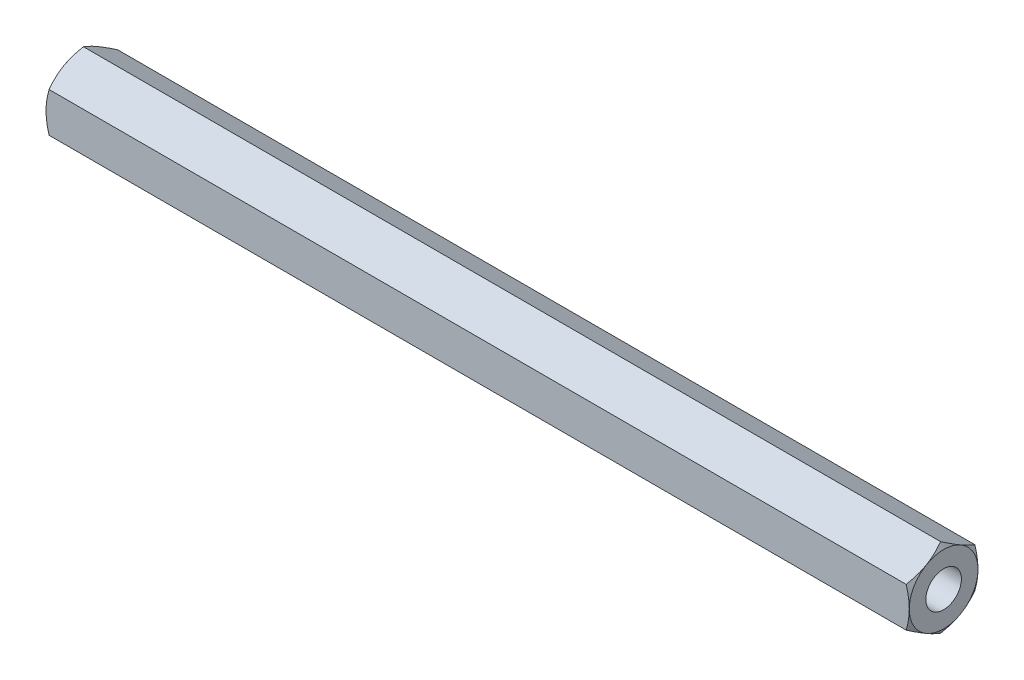
ISO-10303-21;
HEADER;
FILE_DESCRIPTION(('STEP AP214'),'2;1');
FILE_NAME('part.step','',(''),(''),'','','');
FILE_SCHEMA(('AUTOMOTIVE_DESIGN { 1 0 10303 214 1 1 1 1 }'));
ENDSEC;
DATA;
#1=APPLICATION_CONTEXT('core data for automotive mechanical design processes');
#2=APPLICATION_PROTOCOL_DEFINITION('international standard','automotive_design',2000,#1);
#3=PRODUCT_CONTEXT('',#1,'mechanical');
#4=PRODUCT('Part','Part','',(#3));
#5=PRODUCT_RELATED_PRODUCT_CATEGORY('part','',(#4));
#6=PRODUCT_DEFINITION_FORMATION('','',#4);
#7=PRODUCT_DEFINITION_CONTEXT('part definition',#1,'design');
#8=PRODUCT_DEFINITION('design','',#6,#7);
#9=PRODUCT_DEFINITION_SHAPE('','',#8);
#10=(LENGTH_UNIT() NAMED_UNIT(*) SI_UNIT(.MILLI.,.METRE.));
#11=(NAMED_UNIT(*) PLANE_ANGLE_UNIT() SI_UNIT($,.RADIAN.));
#12=(NAMED_UNIT(*) SI_UNIT($,.STERADIAN.) SOLID_ANGLE_UNIT());
#13=UNCERTAINTY_MEASURE_WITH_UNIT(LENGTH_MEASURE(1.E-05),#10,'distance_accuracy_value','');
#14=(GEOMETRIC_REPRESENTATION_CONTEXT(3) GLOBAL_UNCERTAINTY_ASSIGNED_CONTEXT((#13)) GLOBAL_UNIT_ASSIGNED_CONTEXT((#10,
#11,#12)) REPRESENTATION_CONTEXT('',''));
#15=CARTESIAN_POINT('',(0.,0.,0.));
#16=DIRECTION('',(0.,0.,1.));
#17=DIRECTION('',(1.,0.,0.));
#18=AXIS2_PLACEMENT_3D('',#15,#16,#17);
#19=CARTESIAN_POINT('',(100.5,-2.3094010767585,4.));
#20=DIRECTION('',(0.,0.866025403784439,-0.5));
#21=DIRECTION('',(0.,0.5,0.866025403784439));
#22=AXIS2_PLACEMENT_3D('',#19,#20,#21);
#23=PLANE('',#22);
#24=CARTESIAN_POINT('',(100.142667740925,-2.30928560670466,4.0002));
#25=CARTESIAN_POINT('',(100.201282126352,-2.4107717464617,3.82442084967677));
#26=CARTESIAN_POINT('',(100.254589678538,-2.51313390883499,3.64712438367362));
#27=CARTESIAN_POINT('',(100.347638329254,-2.71963072479811,3.28946140682429));
#28=CARTESIAN_POINT('',(100.38734651097,-2.82376904741904,3.10908854102985));
#29=CARTESIAN_POINT('',(100.44915778472,-3.03075510011795,2.75057818129721));
#30=CARTESIAN_POINT('',(100.471672268477,-3.13357098372492,2.57249584706486));
#31=CARTESIAN_POINT('',(100.498549376853,-3.33968651028528,2.21549328283349));
#32=CARTESIAN_POINT('',(100.502934258573,-3.44298540411434,2.0365743503559));
#33=CARTESIAN_POINT('',(100.49380992706,-3.63600352522932,1.70225715780327));
#34=CARTESIAN_POINT('',(100.482541046012,-3.72575165335065,1.54680884001293));
#35=CARTESIAN_POINT('',(100.446826009202,-3.90466320392054,1.23692494436494));
#36=CARTESIAN_POINT('',(100.422367654288,-3.99382600759478,1.08249043825587));
#37=CARTESIAN_POINT('',(100.361223935081,-4.17310641015197,0.771967672225424));
#38=CARTESIAN_POINT('',(100.324279396345,-4.26320131938131,0.615918711936899));
#39=CARTESIAN_POINT('',(100.240429927452,-4.4420474282755,0.306148164596161));
#40=CARTESIAN_POINT('',(100.193544697787,-4.53080091904966,0.152422609226221));
#41=CARTESIAN_POINT('',(100.142667740925,-4.61891762357084,-0.000199999999999044));
#42=B_SPLINE_CURVE_WITH_KNOTS('',3,(#24,#25,#26,#27,#28,#29,#30,#31,#32,#33,#34,#35,#36,#37,#38,
#39,#40,#41),.UNSPECIFIED.,.F.,.F.,(4,2,2,2,2,2,2,2,4),(0.,0.634047835695965,1.26961969224543,
1.88946157213122,2.50854226669297,3.04757825393386,3.58711366126903,4.13861653143764,
4.68903648037743),.UNSPECIFIED.);
#43=CARTESIAN_POINT('',(100.142734410092,-2.30940107675851,4.));
#44=VERTEX_POINT('',#43);
#45=CARTESIAN_POINT('',(100.5,-3.46410161513776,2.));
#46=VERTEX_POINT('',#45);
#47=EDGE_CURVE('E272',#44,#46,#42,.T.);
#48=ORIENTED_EDGE('',*,*,#47,.F.);
#49=DIRECTION('',(-1.,0.,0.));
#50=VECTOR('',#49,1.);
#51=CARTESIAN_POINT('',(100.5,-2.3094010767585,4.));
#52=LINE('',#51,#50);
#53=CARTESIAN_POINT('',(0.357265589908165,-2.30940107675851,4.));
#54=VERTEX_POINT('',#53);
#55=EDGE_CURVE('E337',#44,#54,#52,.T.);
#56=ORIENTED_EDGE('',*,*,#55,.T.);
#57=CARTESIAN_POINT('',(0.357332259074767,-4.61891762357084,-0.00019999999999909));
#58=CARTESIAN_POINT('',(0.298717873648283,-4.5174314838138,0.175579150323229));
#59=CARTESIAN_POINT('',(0.245410321462263,-4.41506932144052,0.352875616326382));
#60=CARTESIAN_POINT('',(0.152361670746403,-4.20857250547739,0.710538593175708));
#61=CARTESIAN_POINT('',(0.112653489029703,-4.10443418285647,0.890911458970153));
#62=CARTESIAN_POINT('',(0.0508422152802781,-3.89744813015756,1.24942181870279));
#63=CARTESIAN_POINT('',(0.0283277315228878,-3.79463224655059,1.42750415293514));
#64=CARTESIAN_POINT('',(0.00145062314658089,-3.58851671999023,1.78450671716651));
#65=CARTESIAN_POINT('',(-0.00293425857305764,-3.48521782616117,1.9634256496441));
#66=CARTESIAN_POINT('',(0.00619007293996928,-3.29219970504619,2.29774284219673));
#67=CARTESIAN_POINT('',(0.0174589539879931,-3.20245157692486,2.45319115998707));
#68=CARTESIAN_POINT('',(0.0531739907981922,-3.02354002635496,2.76307505563506));
#69=CARTESIAN_POINT('',(0.0776323457115324,-2.93437722268072,2.91750956174413));
#70=CARTESIAN_POINT('',(0.138776064919289,-2.75509682012354,3.22803232777458));
#71=CARTESIAN_POINT('',(0.175720603654863,-2.6650019108942,3.3840812880631));
#72=CARTESIAN_POINT('',(0.259570072548027,-2.486155802,3.69385183540384));
#73=CARTESIAN_POINT('',(0.306455302212741,-2.39740231122585,3.84757739077378));
#74=CARTESIAN_POINT('',(0.357332259074768,-2.30928560670466,4.0002));
#75=B_SPLINE_CURVE_WITH_KNOTS('',3,(#57,#58,#59,#60,#61,#62,#63,#64,#65,#66,#67,#68,#69,#70,#71,
#72,#73,#74),.UNSPECIFIED.,.F.,.F.,(4,2,2,2,2,2,2,2,4),(0.,0.634047835695966,1.26961969224544,
1.88946157213122,2.50854226669297,3.04757825393386,3.58711366126904,4.13861653143764,
4.68903648037743),.UNSPECIFIED.);
#76=CARTESIAN_POINT('',(0.,-3.46410161513776,2.));
#77=VERTEX_POINT('',#76);
#78=EDGE_CURVE('E220',#77,#54,#75,.T.);
#79=ORIENTED_EDGE('',*,*,#78,.F.);
#80=CARTESIAN_POINT('',(0.357265589908165,-4.61880215351701,0.));
#81=VERTEX_POINT('',#80);
#82=EDGE_CURVE('E335',#81,#77,#75,.T.);
#83=ORIENTED_EDGE('',*,*,#82,.F.);
#84=DIRECTION('',(-1.,0.,0.));
#85=VECTOR('',#84,1.);
#86=CARTESIAN_POINT('',(100.5,-4.61880215351701,0.));
#87=LINE('',#86,#85);
#88=CARTESIAN_POINT('',(100.142734410092,-4.61880215351701,0.));
#89=VERTEX_POINT('',#88);
#90=EDGE_CURVE('E298',#89,#81,#87,.T.);
#91=ORIENTED_EDGE('',*,*,#90,.F.);
#92=EDGE_CURVE('E267',#46,#89,#42,.T.);
#93=ORIENTED_EDGE('',*,*,#92,.F.);
#94=EDGE_LOOP('',(#48,#56,#79,#83,#91,#93));
#95=FACE_BOUND('',#94,.T.);
#96=ADVANCED_FACE('F41',(#95),#23,.F.);
#97=CARTESIAN_POINT('',(100.5,-4.61880215351701,0.));
#98=DIRECTION('',(0.,0.866025403784439,0.5));
#99=DIRECTION('',(0.,-0.5,0.866025403784439));
#100=AXIS2_PLACEMENT_3D('',#97,#98,#99);
#101=PLANE('',#100);
#102=CARTESIAN_POINT('',(100.142667740925,-4.61891762357084,0.000200000000001246));
#103=CARTESIAN_POINT('',(100.201282126352,-4.5174314838138,-0.175579150323226));
#104=CARTESIAN_POINT('',(100.254589678538,-4.41506932144052,-0.352875616326378));
#105=CARTESIAN_POINT('',(100.347638329254,-4.20857250547739,-0.710538593175705));
#106=CARTESIAN_POINT('',(100.38734651097,-4.10443418285647,-0.89091145897015));
#107=CARTESIAN_POINT('',(100.44915778472,-3.89744813015756,-1.24942181870279));
#108=CARTESIAN_POINT('',(100.471672268477,-3.79463224655059,-1.42750415293514));
#109=CARTESIAN_POINT('',(100.498549376853,-3.58851671999023,-1.78450671716651));
#110=CARTESIAN_POINT('',(100.502934258573,-3.48521782616117,-1.9634256496441));
#111=CARTESIAN_POINT('',(100.49380992706,-3.29219970504619,-2.29774284219673));
#112=CARTESIAN_POINT('',(100.482541046012,-3.20245157692486,-2.45319115998706));
#113=CARTESIAN_POINT('',(100.446826009202,-3.02354002635497,-2.76307505563505));
#114=CARTESIAN_POINT('',(100.422367654288,-2.93437722268073,-2.91750956174413));
#115=CARTESIAN_POINT('',(100.361223935081,-2.75509682012354,-3.22803232777458));
#116=CARTESIAN_POINT('',(100.324279396345,-2.6650019108942,-3.3840812880631));
#117=CARTESIAN_POINT('',(100.240429927452,-2.486155802,-3.69385183540384));
#118=CARTESIAN_POINT('',(100.193544697787,-2.39740231122585,-3.84757739077378));
#119=CARTESIAN_POINT('',(100.142667740925,-2.30928560670467,-4.0002));
#120=B_SPLINE_CURVE_WITH_KNOTS('',3,(#102,#103,#104,#105,#106,#107,#108,#109,#110,#111,#112,
#113,#114,#115,#116,#117,#118,#119),.UNSPECIFIED.,.F.,.F.,(4,2,2,2,2,2,2,2,4),(0.,
0.634047835695965,1.26961969224543,1.88946157213122,2.50854226669297,3.04757825393385,
3.58711366126903,4.13861653143764,4.68903648037743),.UNSPECIFIED.);
#121=CARTESIAN_POINT('',(100.5,-3.46410161513776,-2.));
#122=VERTEX_POINT('',#121);
#123=EDGE_CURVE('E260',#89,#122,#120,.T.);
#124=ORIENTED_EDGE('',*,*,#123,.F.);
#125=ORIENTED_EDGE('',*,*,#90,.T.);
#126=CARTESIAN_POINT('',(0.357332259074767,-2.30928560670467,-4.0002));
#127=CARTESIAN_POINT('',(0.298717873648282,-2.41077174646171,-3.82442084967677));
#128=CARTESIAN_POINT('',(0.245410321462262,-2.513133908835,-3.64712438367362));
#129=CARTESIAN_POINT('',(0.152361670746403,-2.71963072479812,-3.28946140682429));
#130=CARTESIAN_POINT('',(0.112653489029703,-2.82376904741904,-3.10908854102985));
#131=CARTESIAN_POINT('',(0.0508422152802779,-3.03075510011795,-2.75057818129721));
#132=CARTESIAN_POINT('',(0.0283277315228873,-3.13357098372492,-2.57249584706485));
#133=CARTESIAN_POINT('',(0.0014506231465802,-3.33968651028528,-2.21549328283349));
#134=CARTESIAN_POINT('',(-0.00293425857305809,-3.44298540411434,-2.0365743503559));
#135=CARTESIAN_POINT('',(0.00619007293996908,-3.63600352522932,-1.70225715780326));
#136=CARTESIAN_POINT('',(0.0174589539879929,-3.72575165335065,-1.54680884001293));
#137=CARTESIAN_POINT('',(0.0531739907981921,-3.90466320392054,-1.23692494436494));
#138=CARTESIAN_POINT('',(0.0776323457115324,-3.99382600759478,-1.08249043825587));
#139=CARTESIAN_POINT('',(0.138776064919289,-4.17310641015197,-0.771967672225419));
#140=CARTESIAN_POINT('',(0.175720603654863,-4.26320131938131,-0.615918711936895));
#141=CARTESIAN_POINT('',(0.259570072548027,-4.4420474282755,-0.306148164596159));
#142=CARTESIAN_POINT('',(0.30645530221274,-4.53080091904966,-0.15242260922622));
#143=CARTESIAN_POINT('',(0.357332259074767,-4.61891762357084,0.000200000000000922));
#144=B_SPLINE_CURVE_WITH_KNOTS('',3,(#126,#127,#128,#129,#130,#131,#132,#133,#134,#135,#136,
#137,#138,#139,#140,#141,#142,#143),.UNSPECIFIED.,.F.,.F.,(4,2,2,2,2,2,2,2,4),(0.,
0.634047835695967,1.26961969224543,1.88946157213122,2.50854226669297,3.04757825393386,
3.58711366126903,4.13861653143764,4.68903648037743),.UNSPECIFIED.);
#145=CARTESIAN_POINT('',(0.,-3.46410161513776,-2.));
#146=VERTEX_POINT('',#145);
#147=EDGE_CURVE('E232',#146,#81,#144,.T.);
#148=ORIENTED_EDGE('',*,*,#147,.F.);
#149=CARTESIAN_POINT('',(0.357265589908165,-2.30940107675851,-4.));
#150=VERTEX_POINT('',#149);
#151=EDGE_CURVE('E238',#150,#146,#144,.T.);
#152=ORIENTED_EDGE('',*,*,#151,.F.);
#153=DIRECTION('',(-1.,0.,0.));
#154=VECTOR('',#153,1.);
#155=CARTESIAN_POINT('',(100.5,-2.3094010767585,-4.));
#156=LINE('',#155,#154);
#157=CARTESIAN_POINT('',(100.142734410092,-2.30940107675851,-4.));
#158=VERTEX_POINT('',#157);
#159=EDGE_CURVE('E292',#158,#150,#156,.T.);
#160=ORIENTED_EDGE('',*,*,#159,.F.);
#161=EDGE_CURVE('E254',#122,#158,#120,.T.);
#162=ORIENTED_EDGE('',*,*,#161,.F.);
#163=EDGE_LOOP('',(#124,#125,#148,#152,#160,#162));
#164=FACE_BOUND('',#163,.T.);
#165=ADVANCED_FACE('F246',(#164),#101,.F.);
#166=CARTESIAN_POINT('',(100.5,-2.3094010767585,-4.));
#167=DIRECTION('',(0.,0.,1.));
#168=DIRECTION('',(1.,0.,0.));
#169=AXIS2_PLACEMENT_3D('',#166,#167,#168);
#170=PLANE('',#169);
#171=CARTESIAN_POINT('',(98.5858931787594,-6.12487198995893,-4.));
#172=CARTESIAN_POINT('',(98.6707637292331,-5.94924937038677,-4.));
#173=CARTESIAN_POINT('',(98.7547905961926,-5.77321152095287,-4.));
#174=CARTESIAN_POINT('',(98.9206748532029,-5.42008084777955,-4.));
#175=CARTESIAN_POINT('',(99.0025318676328,-5.24298784779928,-4.));
#176=CARTESIAN_POINT('',(99.1640255369415,-4.88656571686334,-4.));
#177=CARTESIAN_POINT('',(99.243646804937,-4.70722958889363,-4.));
#178=CARTESIAN_POINT('',(99.3994694145797,-4.34708334747264,-4.));
#179=CARTESIAN_POINT('',(99.475670934492,-4.16627331143538,-4.));
#180=CARTESIAN_POINT('',(99.6246493496057,-3.80064706744978,-4.));
#181=CARTESIAN_POINT('',(99.6973727157842,-3.6158089282277,-4.));
#182=CARTESIAN_POINT('',(99.8371237690406,-3.24395246794968,-4.));
#183=CARTESIAN_POINT('',(99.9041508224335,-3.05693390695801,-4.));
#184=CARTESIAN_POINT('',(100.030708251569,-2.68080318253771,-4.));
#185=CARTESIAN_POINT('',(100.090254565216,-2.49169643712849,-4.));
#186=CARTESIAN_POINT('',(100.199916643456,-2.11079454635851,-4.));
#187=CARTESIAN_POINT('',(100.250035390323,-1.91900027185749,-4.));
#188=CARTESIAN_POINT('',(100.338409205046,-1.532592326982,-4.));
#189=CARTESIAN_POINT('',(100.376661114043,-1.3379779203165,-4.));
#190=CARTESIAN_POINT('',(100.438725764078,-0.946402725872555,-4.));
#191=CARTESIAN_POINT('',(100.462538492348,-0.749441936019775,-4.));
#192=CARTESIAN_POINT('',(100.493618186851,-0.355451989627944,-4.));
#193=CARTESIAN_POINT('',(100.500989900761,-0.158431311094013,-4.));
#194=CARTESIAN_POINT('',(100.498795933625,0.235472085607466,-4.));
#195=CARTESIAN_POINT('',(100.489234649185,0.432354826312203,-4.));
#196=CARTESIAN_POINT('',(100.459121265386,0.768560635225516,-4.));
#197=CARTESIAN_POINT('',(100.442490703956,0.90825461838182,-4.));
#198=CARTESIAN_POINT('',(100.401786589653,1.18656349063498,-4.));
#199=CARTESIAN_POINT('',(100.377711862942,1.32517820601014,-4.));
#200=CARTESIAN_POINT('',(100.29558492905,1.73929045452971,-4.));
#201=CARTESIAN_POINT('',(100.227651113575,2.01284690528724,-4.));
#202=CARTESIAN_POINT('',(100.110483640683,2.42218253014526,-4.));
#203=CARTESIAN_POINT('',(100.068286058188,2.56009536361541,-4.));
#204=CARTESIAN_POINT('',(99.9797154197722,2.83448159101407,-4.));
#205=CARTESIAN_POINT('',(99.9333452438131,2.97095590623561,-4.));
#206=CARTESIAN_POINT('',(99.8373943008197,3.24189440516345,-4.));
#207=CARTESIAN_POINT('',(99.7878330742465,3.37636557946843,-4.));
#208=CARTESIAN_POINT('',(99.6858016462093,3.6442646115292,-4.));
#209=CARTESIAN_POINT('',(99.6333302690366,3.77769202239393,-4.));
#210=CARTESIAN_POINT('',(99.5796909934582,3.9106369898669,-4.));
#211=B_SPLINE_CURVE_WITH_KNOTS('',3,(#171,#172,#173,#174,#175,#176,#177,#178,#179,#180,#181,
#182,#183,#184,#185,#186,#187,#188,#189,#190,#191,#192,#193,#194,#195,#196,#197,#198,#199,#200,
#201,#202,#203,#204,#205,#206,#207,#208,#209,#210),.UNSPECIFIED.,.F.,.F.,(4,2,2,2,2,2,2,2,2,2,2,
2,2,2,2,2,2,2,2,4),(0.,0.585171792532272,1.17044423059927,1.7590659464599,2.34765694284827,
2.94347400997483,3.53935727210689,4.13394864697601,4.72835161391471,5.32291267067845,
5.91747425310813,6.50823685854036,7.09884609659886,7.52068140825522,7.94258327130841,
8.78701491359832,9.21965281897692,9.65199437116302,10.0819024146298,10.5119854255247),.UNSPECIFIED.);
#212=CARTESIAN_POINT('',(100.5,0.,-4.));
#213=VERTEX_POINT('',#212);
#214=EDGE_CURVE('E261',#158,#213,#211,.T.);
#215=ORIENTED_EDGE('',*,*,#214,.F.);
#216=ORIENTED_EDGE('',*,*,#159,.T.);
#217=CARTESIAN_POINT('',(1.91410682124063,-6.12487198995892,-4.));
#218=CARTESIAN_POINT('',(1.82923627076689,-5.94924937038676,-4.));
#219=CARTESIAN_POINT('',(1.74520940380739,-5.77321152095285,-4.));
#220=CARTESIAN_POINT('',(1.57932514679716,-5.42008084777954,-4.));
#221=CARTESIAN_POINT('',(1.49746813236723,-5.24298784779927,-4.));
#222=CARTESIAN_POINT('',(1.33597446305855,-4.88656571686333,-4.));
#223=CARTESIAN_POINT('',(1.25635319506303,-4.70722958889362,-4.));
#224=CARTESIAN_POINT('',(1.10053058542029,-4.34708334747263,-4.));
#225=CARTESIAN_POINT('',(1.02432906550802,-4.16627331143537,-4.));
#226=CARTESIAN_POINT('',(0.875350650394358,-3.80064706744977,-4.));
#227=CARTESIAN_POINT('',(0.802627284215842,-3.61580892822769,-4.));
#228=CARTESIAN_POINT('',(0.662876230959417,-3.24395246794968,-4.));
#229=CARTESIAN_POINT('',(0.595849177566501,-3.05693390695801,-4.));
#230=CARTESIAN_POINT('',(0.469291748430879,-2.6808031825377,-4.));
#231=CARTESIAN_POINT('',(0.409745434783834,-2.49169643712848,-4.));
#232=CARTESIAN_POINT('',(0.300083356544504,-2.11079454635851,-4.));
#233=CARTESIAN_POINT('',(0.249964609676749,-1.91900027185748,-4.));
#234=CARTESIAN_POINT('',(0.16159079495404,-1.532592326982,-4.));
#235=CARTESIAN_POINT('',(0.123338885956538,-1.33797792031649,-4.));
#236=CARTESIAN_POINT('',(0.0612742359223416,-0.946402725872551,-4.));
#237=CARTESIAN_POINT('',(0.0374615076516972,-0.749441936019771,-4.));
#238=CARTESIAN_POINT('',(0.00638181314943469,-0.355451989627941,-4.));
#239=CARTESIAN_POINT('',(-0.000989900761042853,-0.15843131109401,-4.));
#240=CARTESIAN_POINT('',(0.00120406637479438,0.23547208560747,-4.));
#241=CARTESIAN_POINT('',(0.0107653508153497,0.432354826312206,-4.));
#242=CARTESIAN_POINT('',(0.0408787346135899,0.768560635225519,-4.));
#243=CARTESIAN_POINT('',(0.0575092960439091,0.908254618381822,-4.));
#244=CARTESIAN_POINT('',(0.0982134103466913,1.18656349063498,-4.));
#245=CARTESIAN_POINT('',(0.122288137058446,1.32517820601014,-4.));
#246=CARTESIAN_POINT('',(0.204415070950231,1.7392904545297,-4.));
#247=CARTESIAN_POINT('',(0.272348886425154,2.01284690528723,-4.));
#248=CARTESIAN_POINT('',(0.389516359317205,2.42218253014525,-4.));
#249=CARTESIAN_POINT('',(0.431713941811638,2.56009536361539,-4.));
#250=CARTESIAN_POINT('',(0.520284580227764,2.83448159101405,-4.));
#251=CARTESIAN_POINT('',(0.566654756186914,2.97095590623558,-4.));
#252=CARTESIAN_POINT('',(0.662605699180289,3.24189440516342,-4.));
#253=CARTESIAN_POINT('',(0.712166925753503,3.37636557946839,-4.));
#254=CARTESIAN_POINT('',(0.814198353790705,3.64426461152915,-4.));
#255=CARTESIAN_POINT('',(0.866669730963372,3.77769202239388,-4.));
#256=CARTESIAN_POINT('',(0.920309006541796,3.91063698986685,-4.));
#257=B_SPLINE_CURVE_WITH_KNOTS('',3,(#217,#218,#219,#220,#221,#222,#223,#224,#225,#226,#227,
#228,#229,#230,#231,#232,#233,#234,#235,#236,#237,#238,#239,#240,#241,#242,#243,#244,#245,#246,
#247,#248,#249,#250,#251,#252,#253,#254,#255,#256),.UNSPECIFIED.,.F.,.F.,(4,2,2,2,2,2,2,2,2,2,2,
2,2,2,2,2,2,2,2,4),(0.,0.585171792532272,1.17044423059927,1.7590659464599,2.34765694284827,
2.94347400997483,3.53935727210689,4.133948646976,4.72835161391471,5.32291267067845,
5.91747425310812,6.50823685854036,7.09884609659886,7.52068140825521,7.94258327130839,
8.7870149135983,9.21965281897689,9.65199437116298,10.0819024146297,10.5119854255247),.UNSPECIFIED.);
#258=CARTESIAN_POINT('',(0.,0.,-4.));
#259=VERTEX_POINT('',#258);
#260=EDGE_CURVE('E239',#259,#150,#257,.F.);
#261=ORIENTED_EDGE('',*,*,#260,.F.);
#262=CARTESIAN_POINT('',(0.357265589908165,2.3094010767585,-4.));
#263=VERTEX_POINT('',#262);
#264=EDGE_CURVE('E346',#263,#259,#257,.F.);
#265=ORIENTED_EDGE('',*,*,#264,.F.);
#266=DIRECTION('',(-1.,0.,0.));
#267=VECTOR('',#266,1.);
#268=CARTESIAN_POINT('',(100.5,2.30940107675851,-4.));
#269=LINE('',#268,#267);
#270=CARTESIAN_POINT('',(100.142734410092,2.3094010767585,-4.));
#271=VERTEX_POINT('',#270);
#272=EDGE_CURVE('E299',#271,#263,#269,.T.);
#273=ORIENTED_EDGE('',*,*,#272,.F.);
#274=EDGE_CURVE('E262',#213,#271,#211,.T.);
#275=ORIENTED_EDGE('',*,*,#274,.F.);
#276=EDGE_LOOP('',(#215,#216,#261,#265,#273,#275));
#277=FACE_BOUND('',#276,.T.);
#278=ADVANCED_FACE('F249',(#277),#170,.F.);
#279=CARTESIAN_POINT('',(100.5,2.30940107675851,-4.));
#280=DIRECTION('',(0.,-0.866025403784439,0.5));
#281=DIRECTION('',(0.,-0.5,-0.866025403784439));
#282=AXIS2_PLACEMENT_3D('',#279,#280,#281);
#283=PLANE('',#282);
#284=CARTESIAN_POINT('',(100.142667740925,2.30928560670467,-4.0002));
#285=CARTESIAN_POINT('',(100.201282126352,2.41077174646171,-3.82442084967677));
#286=CARTESIAN_POINT('',(100.254589678538,2.513133908835,-3.64712438367362));
#287=CARTESIAN_POINT('',(100.347638329254,2.71963072479812,-3.28946140682429));
#288=CARTESIAN_POINT('',(100.38734651097,2.82376904741904,-3.10908854102985));
#289=CARTESIAN_POINT('',(100.44915778472,3.03075510011795,-2.75057818129721));
#290=CARTESIAN_POINT('',(100.471672268477,3.13357098372492,-2.57249584706486));
#291=CARTESIAN_POINT('',(100.498549376853,3.33968651028528,-2.21549328283349));
#292=CARTESIAN_POINT('',(100.502934258573,3.44298540411434,-2.0365743503559));
#293=CARTESIAN_POINT('',(100.49380992706,3.63600352522932,-1.70225715780327));
#294=CARTESIAN_POINT('',(100.482541046012,3.72575165335065,-1.54680884001293));
#295=CARTESIAN_POINT('',(100.446826009202,3.90466320392054,-1.23692494436495));
#296=CARTESIAN_POINT('',(100.422367654288,3.99382600759478,-1.08249043825587));
#297=CARTESIAN_POINT('',(100.361223935081,4.17310641015197,-0.771967672225423));
#298=CARTESIAN_POINT('',(100.324279396345,4.26320131938131,-0.615918711936899));
#299=CARTESIAN_POINT('',(100.240429927452,4.4420474282755,-0.306148164596162));
#300=CARTESIAN_POINT('',(100.193544697787,4.53080091904966,-0.152422609226222));
#301=CARTESIAN_POINT('',(100.142667740925,4.61891762357085,0.000199999999998931));
#302=B_SPLINE_CURVE_WITH_KNOTS('',3,(#284,#285,#286,#287,#288,#289,#290,#291,#292,#293,#294,
#295,#296,#297,#298,#299,#300,#301),.UNSPECIFIED.,.F.,.F.,(4,2,2,2,2,2,2,2,4),(0.,
0.634047835695964,1.26961969224543,1.88946157213122,2.50854226669297,3.04757825393385,
3.58711366126903,4.13861653143763,4.68903648037743),.UNSPECIFIED.);
#303=CARTESIAN_POINT('',(100.5,3.46410161513776,-2.));
#304=VERTEX_POINT('',#303);
#305=EDGE_CURVE('E360',#271,#304,#302,.T.);
#306=ORIENTED_EDGE('',*,*,#305,.F.);
#307=ORIENTED_EDGE('',*,*,#272,.T.);
#308=CARTESIAN_POINT('',(0.357332259074769,4.61891762357085,0.000199999999999029));
#309=CARTESIAN_POINT('',(0.298717873648284,4.51743148381381,-0.175579150323229));
#310=CARTESIAN_POINT('',(0.245410321462264,4.41506932144052,-0.352875616326382));
#311=CARTESIAN_POINT('',(0.152361670746404,4.2085725054774,-0.710538593175708));
#312=CARTESIAN_POINT('',(0.112653489029704,4.10443418285647,-0.890911458970153));
#313=CARTESIAN_POINT('',(0.0508422152802787,3.89744813015756,-1.24942181870279));
#314=CARTESIAN_POINT('',(0.0283277315228885,3.79463224655059,-1.42750415293514));
#315=CARTESIAN_POINT('',(0.00145062314658171,3.58851671999023,-1.78450671716651));
#316=CARTESIAN_POINT('',(-0.00293425857305672,3.48521782616117,-1.9634256496441));
#317=CARTESIAN_POINT('',(0.00619007293997046,3.29219970504619,-2.29774284219674));
#318=CARTESIAN_POINT('',(0.0174589539879944,3.20245157692486,-2.45319115998707));
#319=CARTESIAN_POINT('',(0.0531739907981932,3.02354002635497,-2.76307505563506));
#320=CARTESIAN_POINT('',(0.077632345711533,2.93437722268073,-2.91750956174413));
#321=CARTESIAN_POINT('',(0.13877606491929,2.75509682012354,-3.22803232777458));
#322=CARTESIAN_POINT('',(0.175720603654864,2.6650019108942,-3.3840812880631));
#323=CARTESIAN_POINT('',(0.259570072548028,2.48615580200001,-3.69385183540384));
#324=CARTESIAN_POINT('',(0.306455302212741,2.39740231122585,-3.84757739077378));
#325=CARTESIAN_POINT('',(0.357332259074767,2.30928560670467,-4.0002));
#326=B_SPLINE_CURVE_WITH_KNOTS('',3,(#308,#309,#310,#311,#312,#313,#314,#315,#316,#317,#318,
#319,#320,#321,#322,#323,#324,#325),.UNSPECIFIED.,.F.,.F.,(4,2,2,2,2,2,2,2,4),(0.,
0.634047835695967,1.26961969224543,1.88946157213122,2.50854226669297,3.04757825393386,
3.58711366126903,4.13861653143764,4.68903648037743),.UNSPECIFIED.);
#327=CARTESIAN_POINT('',(0.,3.46410161513776,-2.));
#328=VERTEX_POINT('',#327);
#329=EDGE_CURVE('E343',#328,#263,#326,.T.);
#330=ORIENTED_EDGE('',*,*,#329,.F.);
#331=CARTESIAN_POINT('',(0.357265589908165,4.61880215351701,0.));
#332=VERTEX_POINT('',#331);
#333=EDGE_CURVE('E226',#332,#328,#326,.T.);
#334=ORIENTED_EDGE('',*,*,#333,.F.);
#335=DIRECTION('',(-1.,0.,0.));
#336=VECTOR('',#335,1.);
#337=CARTESIAN_POINT('',(100.5,4.61880215351701,0.));
#338=LINE('',#337,#336);
#339=CARTESIAN_POINT('',(100.142734410092,4.61880215351701,0.));
#340=VERTEX_POINT('',#339);
#341=EDGE_CURVE('E303',#340,#332,#338,.T.);
#342=ORIENTED_EDGE('',*,*,#341,.F.);
#343=EDGE_CURVE('E359',#304,#340,#302,.T.);
#344=ORIENTED_EDGE('',*,*,#343,.F.);
#345=EDGE_LOOP('',(#306,#307,#330,#334,#342,#344));
#346=FACE_BOUND('',#345,.T.);
#347=ADVANCED_FACE('F358',(#346),#283,.F.);
#348=CARTESIAN_POINT('',(100.5,4.61880215351701,0.));
#349=DIRECTION('',(0.,-0.866025403784439,-0.5));
#350=DIRECTION('',(0.,0.5,-0.866025403784439));
#351=AXIS2_PLACEMENT_3D('',#348,#349,#350);
#352=PLANE('',#351);
#353=CARTESIAN_POINT('',(100.142667740925,4.61891762357085,-0.000200000000000971));
#354=CARTESIAN_POINT('',(100.201282126352,4.51743148381381,0.175579150323225));
#355=CARTESIAN_POINT('',(100.254589678538,4.41506932144052,0.352875616326377));
#356=CARTESIAN_POINT('',(100.347638329254,4.2085725054774,0.710538593175703));
#357=CARTESIAN_POINT('',(100.38734651097,4.10443418285647,0.890911458970149));
#358=CARTESIAN_POINT('',(100.44915778472,3.89744813015756,1.24942181870279));
#359=CARTESIAN_POINT('',(100.471672268477,3.79463224655059,1.42750415293514));
#360=CARTESIAN_POINT('',(100.498549376853,3.58851671999023,1.78450671716651));
#361=CARTESIAN_POINT('',(100.502934258573,3.48521782616117,1.9634256496441));
#362=CARTESIAN_POINT('',(100.49380992706,3.29219970504619,2.29774284219673));
#363=CARTESIAN_POINT('',(100.482541046012,3.20245157692486,2.45319115998707));
#364=CARTESIAN_POINT('',(100.446826009202,3.02354002635497,2.76307505563506));
#365=CARTESIAN_POINT('',(100.422367654288,2.93437722268073,2.91750956174413));
#366=CARTESIAN_POINT('',(100.361223935081,2.75509682012354,3.22803232777458));
#367=CARTESIAN_POINT('',(100.324279396345,2.6650019108942,3.3840812880631));
#368=CARTESIAN_POINT('',(100.240429927452,2.48615580200001,3.69385183540384));
#369=CARTESIAN_POINT('',(100.193544697787,2.39740231122585,3.84757739077378));
#370=CARTESIAN_POINT('',(100.142667740925,2.30928560670467,4.0002));
#371=B_SPLINE_CURVE_WITH_KNOTS('',3,(#353,#354,#355,#356,#357,#358,#359,#360,#361,#362,#363,
#364,#365,#366,#367,#368,#369,#370),.UNSPECIFIED.,.F.,.F.,(4,2,2,2,2,2,2,2,4),(0.,
0.634047835695962,1.26961969224543,1.88946157213122,2.50854226669297,3.04757825393386,
3.58711366126904,4.13861653143764,4.68903648037743),.UNSPECIFIED.);
#372=CARTESIAN_POINT('',(100.5,3.46410161513776,2.));
#373=VERTEX_POINT('',#372);
#374=EDGE_CURVE('E354',#340,#373,#371,.T.);
#375=ORIENTED_EDGE('',*,*,#374,.F.);
#376=ORIENTED_EDGE('',*,*,#341,.T.);
#377=CARTESIAN_POINT('',(0.357332259074768,2.30928560670467,4.0002));
#378=CARTESIAN_POINT('',(0.298717873648284,2.41077174646171,3.82442084967677));
#379=CARTESIAN_POINT('',(0.245410321462264,2.513133908835,3.64712438367362));
#380=CARTESIAN_POINT('',(0.152361670746404,2.71963072479812,3.28946140682429));
#381=CARTESIAN_POINT('',(0.112653489029704,2.82376904741904,3.10908854102985));
#382=CARTESIAN_POINT('',(0.0508422152802788,3.03075510011795,2.75057818129721));
#383=CARTESIAN_POINT('',(0.0283277315228887,3.13357098372492,2.57249584706486));
#384=CARTESIAN_POINT('',(0.00145062314658153,3.33968651028529,2.21549328283349));
#385=CARTESIAN_POINT('',(-0.00293425857305726,3.44298540411434,2.0365743503559));
#386=CARTESIAN_POINT('',(0.00619007293996989,3.63600352522933,1.70225715780327));
#387=CARTESIAN_POINT('',(0.0174589539879941,3.72575165335065,1.54680884001293));
#388=CARTESIAN_POINT('',(0.0531739907981935,3.90466320392055,1.23692494436494));
#389=CARTESIAN_POINT('',(0.0776323457115335,3.99382600759479,1.08249043825587));
#390=CARTESIAN_POINT('',(0.13877606491929,4.17310641015197,0.771967672225421));
#391=CARTESIAN_POINT('',(0.175720603654864,4.26320131938131,0.615918711936897));
#392=CARTESIAN_POINT('',(0.259570072548028,4.44204742827551,0.30614816459616));
#393=CARTESIAN_POINT('',(0.306455302212742,4.53080091904966,0.152422609226219));
#394=CARTESIAN_POINT('',(0.357332259074769,4.61891762357085,-0.000200000000001357));
#395=B_SPLINE_CURVE_WITH_KNOTS('',3,(#377,#378,#379,#380,#381,#382,#383,#384,#385,#386,#387,
#388,#389,#390,#391,#392,#393,#394),.UNSPECIFIED.,.F.,.F.,(4,2,2,2,2,2,2,2,4),(0.,
0.634047835695967,1.26961969224544,1.88946157213122,2.50854226669297,3.04757825393386,
3.58711366126904,4.13861653143764,4.68903648037743),.UNSPECIFIED.);
#396=CARTESIAN_POINT('',(0.,3.46410161513776,2.));
#397=VERTEX_POINT('',#396);
#398=EDGE_CURVE('E338',#397,#332,#395,.T.);
#399=ORIENTED_EDGE('',*,*,#398,.F.);
#400=CARTESIAN_POINT('',(0.357265589908165,2.30940107675851,4.));
#401=VERTEX_POINT('',#400);
#402=EDGE_CURVE('E201',#401,#397,#395,.T.);
#403=ORIENTED_EDGE('',*,*,#402,.F.);
#404=DIRECTION('',(-1.,0.,0.));
#405=VECTOR('',#404,1.);
#406=CARTESIAN_POINT('',(100.5,2.3094010767585,4.));
#407=LINE('',#406,#405);
#408=CARTESIAN_POINT('',(100.142734410092,2.30940107675851,4.));
#409=VERTEX_POINT('',#408);
#410=EDGE_CURVE('E348',#409,#401,#407,.T.);
#411=ORIENTED_EDGE('',*,*,#410,.F.);
#412=EDGE_CURVE('E166',#373,#409,#371,.T.);
#413=ORIENTED_EDGE('',*,*,#412,.F.);
#414=EDGE_LOOP('',(#375,#376,#399,#403,#411,#413));
#415=FACE_BOUND('',#414,.T.);
#416=ADVANCED_FACE('F182',(#415),#352,.F.);
#417=CARTESIAN_POINT('',(100.5,2.3094010767585,4.));
#418=DIRECTION('',(0.,0.,-1.));
#419=DIRECTION('',(-1.,0.,0.));
#420=AXIS2_PLACEMENT_3D('',#417,#418,#419);
#421=PLANE('',#420);
#422=CARTESIAN_POINT('',(98.5858931787594,-6.12487198995893,4.));
#423=CARTESIAN_POINT('',(98.6707637292331,-5.94924937038677,4.));
#424=CARTESIAN_POINT('',(98.7547905961926,-5.77321152095287,4.));
#425=CARTESIAN_POINT('',(98.9206748532029,-5.42008084777955,4.));
#426=CARTESIAN_POINT('',(99.0025318676328,-5.24298784779928,4.));
#427=CARTESIAN_POINT('',(99.1640255369415,-4.88656571686334,4.));
#428=CARTESIAN_POINT('',(99.243646804937,-4.70722958889362,4.));
#429=CARTESIAN_POINT('',(99.3994694145797,-4.34708334747263,4.));
#430=CARTESIAN_POINT('',(99.475670934492,-4.16627331143538,4.));
#431=CARTESIAN_POINT('',(99.6246493496057,-3.80064706744977,4.));
#432=CARTESIAN_POINT('',(99.6973727157842,-3.6158089282277,4.));
#433=CARTESIAN_POINT('',(99.8371237690406,-3.24395246794968,4.));
#434=CARTESIAN_POINT('',(99.9041508224335,-3.05693390695801,4.));
#435=CARTESIAN_POINT('',(100.030708251569,-2.6808031825377,4.));
#436=CARTESIAN_POINT('',(100.090254565216,-2.49169643712848,4.));
#437=CARTESIAN_POINT('',(100.199916643456,-2.11079454635851,4.));
#438=CARTESIAN_POINT('',(100.250035390323,-1.91900027185748,4.));
#439=CARTESIAN_POINT('',(100.338409205046,-1.532592326982,4.));
#440=CARTESIAN_POINT('',(100.376661114043,-1.33797792031649,4.));
#441=CARTESIAN_POINT('',(100.438725764078,-0.946402725872551,4.));
#442=CARTESIAN_POINT('',(100.462538492348,-0.749441936019771,4.));
#443=CARTESIAN_POINT('',(100.493618186851,-0.35545198962794,4.));
#444=CARTESIAN_POINT('',(100.500989900761,-0.158431311094009,4.));
#445=CARTESIAN_POINT('',(100.498795933625,0.23547208560747,4.));
#446=CARTESIAN_POINT('',(100.489234649185,0.432354826312206,4.));
#447=CARTESIAN_POINT('',(100.459121265386,0.76856063522552,4.));
#448=CARTESIAN_POINT('',(100.442490703956,0.908254618381825,4.));
#449=CARTESIAN_POINT('',(100.401786589653,1.18656349063498,4.));
#450=CARTESIAN_POINT('',(100.377711862942,1.32517820601015,4.));
#451=CARTESIAN_POINT('',(100.29558492905,1.73929045452971,4.));
#452=CARTESIAN_POINT('',(100.227651113575,2.01284690528725,4.));
#453=CARTESIAN_POINT('',(100.110483640683,2.42218253014527,4.));
#454=CARTESIAN_POINT('',(100.068286058188,2.56009536361542,4.));
#455=CARTESIAN_POINT('',(99.9797154197722,2.83448159101408,4.));
#456=CARTESIAN_POINT('',(99.9333452438131,2.97095590623562,4.));
#457=CARTESIAN_POINT('',(99.8373943008197,3.24189440516346,4.));
#458=CARTESIAN_POINT('',(99.7878330742465,3.37636557946844,4.));
#459=CARTESIAN_POINT('',(99.6858016462093,3.6442646115292,4.));
#460=CARTESIAN_POINT('',(99.6333302690366,3.77769202239394,4.));
#461=CARTESIAN_POINT('',(99.5796909934582,3.91063698986691,4.));
#462=B_SPLINE_CURVE_WITH_KNOTS('',3,(#422,#423,#424,#425,#426,#427,#428,#429,#430,#431,#432,
#433,#434,#435,#436,#437,#438,#439,#440,#441,#442,#443,#444,#445,#446,#447,#448,#449,#450,#451,
#452,#453,#454,#455,#456,#457,#458,#459,#460,#461),.UNSPECIFIED.,.F.,.F.,(4,2,2,2,2,2,2,2,2,2,2,
2,2,2,2,2,2,2,2,4),(0.,0.585171792532271,1.17044423059928,1.7590659464599,2.34765694284827,
2.94347400997484,3.53935727210689,4.13394864697601,4.72835161391471,5.32291267067845,
5.91747425310813,6.50823685854037,7.09884609659886,7.52068140825522,7.94258327130841,
8.78701491359833,9.21965281897693,9.65199437116302,10.0819024146298,10.5119854255248),.UNSPECIFIED.);
#463=CARTESIAN_POINT('',(100.5,0.,4.));
#464=VERTEX_POINT('',#463);
#465=EDGE_CURVE('E165',#409,#464,#462,.F.);
#466=ORIENTED_EDGE('',*,*,#465,.F.);
#467=ORIENTED_EDGE('',*,*,#410,.T.);
#468=CARTESIAN_POINT('',(1.91410682124064,-6.12487198995891,4.));
#469=CARTESIAN_POINT('',(1.82923627076689,-5.94924937038676,4.));
#470=CARTESIAN_POINT('',(1.74520940380739,-5.77321152095285,4.));
#471=CARTESIAN_POINT('',(1.57932514679716,-5.42008084777954,4.));
#472=CARTESIAN_POINT('',(1.49746813236723,-5.24298784779927,4.));
#473=CARTESIAN_POINT('',(1.33597446305855,-4.88656571686333,4.));
#474=CARTESIAN_POINT('',(1.25635319506303,-4.70722958889362,4.));
#475=CARTESIAN_POINT('',(1.10053058542029,-4.34708334747263,4.));
#476=CARTESIAN_POINT('',(1.02432906550802,-4.16627331143537,4.));
#477=CARTESIAN_POINT('',(0.875350650394359,-3.80064706744977,4.));
#478=CARTESIAN_POINT('',(0.802627284215842,-3.61580892822769,4.));
#479=CARTESIAN_POINT('',(0.662876230959417,-3.24395246794968,4.));
#480=CARTESIAN_POINT('',(0.595849177566501,-3.05693390695801,4.));
#481=CARTESIAN_POINT('',(0.469291748430879,-2.6808031825377,4.));
#482=CARTESIAN_POINT('',(0.409745434783835,-2.49169643712848,4.));
#483=CARTESIAN_POINT('',(0.300083356544505,-2.11079454635851,4.));
#484=CARTESIAN_POINT('',(0.24996460967675,-1.91900027185748,4.));
#485=CARTESIAN_POINT('',(0.16159079495404,-1.53259232698199,4.));
#486=CARTESIAN_POINT('',(0.123338885956539,-1.33797792031649,4.));
#487=CARTESIAN_POINT('',(0.0612742359223426,-0.946402725872548,4.));
#488=CARTESIAN_POINT('',(0.0374615076516981,-0.749441936019768,4.));
#489=CARTESIAN_POINT('',(0.0063818131494358,-0.355451989627937,4.));
#490=CARTESIAN_POINT('',(-0.000989900761041474,-0.158431311094006,4.));
#491=CARTESIAN_POINT('',(0.001204066374796,0.235472085607473,4.));
#492=CARTESIAN_POINT('',(0.0107653508153513,0.432354826312209,4.));
#493=CARTESIAN_POINT('',(0.0408787346135914,0.768560635225521,4.));
#494=CARTESIAN_POINT('',(0.0575092960439106,0.908254618381824,4.));
#495=CARTESIAN_POINT('',(0.098213410346693,1.18656349063498,4.));
#496=CARTESIAN_POINT('',(0.122288137058448,1.32517820601014,4.));
#497=CARTESIAN_POINT('',(0.204415070950233,1.7392904545297,4.));
#498=CARTESIAN_POINT('',(0.272348886425156,2.01284690528723,4.));
#499=CARTESIAN_POINT('',(0.389516359317207,2.42218253014525,4.));
#500=CARTESIAN_POINT('',(0.43171394181164,2.56009536361539,4.));
#501=CARTESIAN_POINT('',(0.520284580227766,2.83448159101405,4.));
#502=CARTESIAN_POINT('',(0.566654756186916,2.97095590623559,4.));
#503=CARTESIAN_POINT('',(0.662605699180291,3.24189440516342,4.));
#504=CARTESIAN_POINT('',(0.712166925753505,3.37636557946839,4.));
#505=CARTESIAN_POINT('',(0.814198353790707,3.64426461152915,4.));
#506=CARTESIAN_POINT('',(0.866669730963375,3.77769202239389,4.));
#507=CARTESIAN_POINT('',(0.920309006541799,3.91063698986686,4.));
#508=B_SPLINE_CURVE_WITH_KNOTS('',3,(#468,#469,#470,#471,#472,#473,#474,#475,#476,#477,#478,
#479,#480,#481,#482,#483,#484,#485,#486,#487,#488,#489,#490,#491,#492,#493,#494,#495,#496,#497,
#498,#499,#500,#501,#502,#503,#504,#505,#506,#507),.UNSPECIFIED.,.F.,.F.,(4,2,2,2,2,2,2,2,2,2,2,
2,2,2,2,2,2,2,2,4),(0.,0.58517179253227,1.17044423059927,1.7590659464599,2.34765694284827,
2.94347400997483,3.53935727210689,4.133948646976,4.72835161391471,5.32291267067845,
5.91747425310813,6.50823685854036,7.09884609659886,7.52068140825521,7.9425832713084,
8.7870149135983,9.2196528189769,9.65199437116298,10.0819024146297,10.5119854255247),.UNSPECIFIED.);
#509=CARTESIAN_POINT('',(0.,0.,4.));
#510=VERTEX_POINT('',#509);
#511=EDGE_CURVE('E190',#510,#401,#508,.T.);
#512=ORIENTED_EDGE('',*,*,#511,.F.);
#513=EDGE_CURVE('E198',#54,#510,#508,.T.);
#514=ORIENTED_EDGE('',*,*,#513,.F.);
#515=ORIENTED_EDGE('',*,*,#55,.F.);
#516=EDGE_CURVE('E157',#464,#44,#462,.F.);
#517=ORIENTED_EDGE('',*,*,#516,.F.);
#518=EDGE_LOOP('',(#466,#467,#512,#514,#515,#517));
#519=FACE_BOUND('',#518,.T.);
#520=ADVANCED_FACE('F177',(#519),#421,.F.);
#521=CARTESIAN_POINT('',(0.,0.,0.));
#522=DIRECTION('',(1.,0.,0.));
#523=DIRECTION('',(0.,0.,-1.));
#524=AXIS2_PLACEMENT_3D('',#521,#522,#523);
#525=CONICAL_SURFACE('',#524,4.,1.0471975511966);
#526=ORIENTED_EDGE('',*,*,#260,.T.);
#527=ORIENTED_EDGE('',*,*,#151,.T.);
#528=CARTESIAN_POINT('',(0.,0.,0.));
#529=DIRECTION('',(1.,0.,0.));
#530=DIRECTION('',(0.,0.,-1.));
#531=AXIS2_PLACEMENT_3D('',#528,#529,#530);
#532=CIRCLE('',#531,4.);
#533=EDGE_CURVE('E301',#146,#259,#532,.T.);
#534=ORIENTED_EDGE('',*,*,#533,.T.);
#535=EDGE_LOOP('',(#526,#527,#534));
#536=FACE_BOUND('',#535,.T.);
#537=ADVANCED_FACE('F181',(#536),#525,.T.);
#538=ORIENTED_EDGE('',*,*,#147,.T.);
#539=ORIENTED_EDGE('',*,*,#82,.T.);
#540=EDGE_CURVE('E307',#77,#146,#532,.T.);
#541=ORIENTED_EDGE('',*,*,#540,.T.);
#542=EDGE_LOOP('',(#538,#539,#541));
#543=FACE_BOUND('',#542,.T.);
#544=ADVANCED_FACE('F509',(#543),#525,.T.);
#545=ORIENTED_EDGE('',*,*,#78,.T.);
#546=ORIENTED_EDGE('',*,*,#513,.T.);
#547=EDGE_CURVE('E311',#510,#77,#532,.T.);
#548=ORIENTED_EDGE('',*,*,#547,.T.);
#549=EDGE_LOOP('',(#545,#546,#548));
#550=FACE_BOUND('',#549,.T.);
#551=ADVANCED_FACE('F325',(#550),#525,.T.);
#552=ORIENTED_EDGE('',*,*,#402,.T.);
#553=CARTESIAN_POINT('',(0.,0.,0.));
#554=DIRECTION('',(-1.,0.,0.));
#555=DIRECTION('',(0.,0.,1.));
#556=AXIS2_PLACEMENT_3D('',#553,#554,#555);
#557=CIRCLE('',#556,4.);
#558=EDGE_CURVE('E199',#510,#397,#557,.T.);
#559=ORIENTED_EDGE('',*,*,#558,.F.);
#560=ORIENTED_EDGE('',*,*,#511,.T.);
#561=EDGE_LOOP('',(#552,#559,#560));
#562=FACE_BOUND('',#561,.T.);
#563=ADVANCED_FACE('F212',(#562),#525,.T.);
#564=ORIENTED_EDGE('',*,*,#333,.T.);
#565=EDGE_CURVE('E313',#328,#397,#532,.T.);
#566=ORIENTED_EDGE('',*,*,#565,.T.);
#567=ORIENTED_EDGE('',*,*,#398,.T.);
#568=EDGE_LOOP('',(#564,#566,#567));
#569=FACE_BOUND('',#568,.T.);
#570=ADVANCED_FACE('F210',(#569),#525,.T.);
#571=ORIENTED_EDGE('',*,*,#264,.T.);
#572=EDGE_CURVE('E288',#259,#328,#532,.T.);
#573=ORIENTED_EDGE('',*,*,#572,.T.);
#574=ORIENTED_EDGE('',*,*,#329,.T.);
#575=EDGE_LOOP('',(#571,#573,#574));
#576=FACE_BOUND('',#575,.T.);
#577=ADVANCED_FACE('F207',(#576),#525,.T.);
#578=CARTESIAN_POINT('',(0.,0.,0.));
#579=DIRECTION('',(1.,0.,0.));
#580=DIRECTION('',(0.,0.,-1.));
#581=AXIS2_PLACEMENT_3D('',#578,#579,#580);
#582=PLANE('',#581);
#583=CARTESIAN_POINT('',(0.,0.,0.));
#584=DIRECTION('',(-1.,0.,0.));
#585=DIRECTION('',(0.,0.,1.));
#586=AXIS2_PLACEMENT_3D('',#583,#584,#585);
#587=CIRCLE('',#586,2.067);
#588=CARTESIAN_POINT('',(0.,0.,2.067));
#589=VERTEX_POINT('',#588);
#590=EDGE_CURVE('E145',#589,#589,#587,.T.);
#591=ORIENTED_EDGE('',*,*,#590,.F.);
#592=EDGE_LOOP('',(#591));
#593=FACE_BOUND('',#592,.T.);
#594=ORIENTED_EDGE('',*,*,#572,.F.);
#595=ORIENTED_EDGE('',*,*,#533,.F.);
#596=ORIENTED_EDGE('',*,*,#540,.F.);
#597=ORIENTED_EDGE('',*,*,#547,.F.);
#598=ORIENTED_EDGE('',*,*,#558,.T.);
#599=ORIENTED_EDGE('',*,*,#565,.F.);
#600=EDGE_LOOP('',(#594,#595,#596,#597,#598,#599));
#601=FACE_BOUND('',#600,.T.);
#602=ADVANCED_FACE('F184',(#593,#601),#582,.F.);
#603=CARTESIAN_POINT('',(100.142734410092,0.,0.));
#604=DIRECTION('',(-1.,0.,0.));
#605=DIRECTION('',(0.,0.,1.));
#606=AXIS2_PLACEMENT_3D('',#603,#604,#605);
#607=CONICAL_SURFACE('',#606,4.61880215351701,1.0471975511966);
#608=ORIENTED_EDGE('',*,*,#161,.T.);
#609=ORIENTED_EDGE('',*,*,#214,.T.);
#610=CARTESIAN_POINT('',(100.5,0.,0.));
#611=DIRECTION('',(1.,0.,0.));
#612=DIRECTION('',(0.,0.,-1.));
#613=AXIS2_PLACEMENT_3D('',#610,#611,#612);
#614=CIRCLE('',#613,4.);
#615=EDGE_CURVE('E45',#122,#213,#614,.T.);
#616=ORIENTED_EDGE('',*,*,#615,.F.);
#617=EDGE_LOOP('',(#608,#609,#616));
#618=FACE_BOUND('',#617,.T.);
#619=ADVANCED_FACE('F285',(#618),#607,.T.);
#620=ORIENTED_EDGE('',*,*,#92,.T.);
#621=ORIENTED_EDGE('',*,*,#123,.T.);
#622=EDGE_CURVE('E280',#46,#122,#614,.T.);
#623=ORIENTED_EDGE('',*,*,#622,.F.);
#624=EDGE_LOOP('',(#620,#621,#623));
#625=FACE_BOUND('',#624,.T.);
#626=ADVANCED_FACE('F278',(#625),#607,.T.);
#627=ORIENTED_EDGE('',*,*,#47,.T.);
#628=EDGE_CURVE('E289',#464,#46,#614,.T.);
#629=ORIENTED_EDGE('',*,*,#628,.F.);
#630=ORIENTED_EDGE('',*,*,#516,.T.);
#631=EDGE_LOOP('',(#627,#629,#630));
#632=FACE_BOUND('',#631,.T.);
#633=ADVANCED_FACE('F173',(#632),#607,.T.);
#634=ORIENTED_EDGE('',*,*,#412,.T.);
#635=ORIENTED_EDGE('',*,*,#465,.T.);
#636=CARTESIAN_POINT('',(100.5,0.,0.));
#637=DIRECTION('',(-1.,0.,0.));
#638=DIRECTION('',(0.,0.,1.));
#639=AXIS2_PLACEMENT_3D('',#636,#637,#638);
#640=CIRCLE('',#639,4.);
#641=EDGE_CURVE('E63',#464,#373,#640,.T.);
#642=ORIENTED_EDGE('',*,*,#641,.T.);
#643=EDGE_LOOP('',(#634,#635,#642));
#644=FACE_BOUND('',#643,.T.);
#645=ADVANCED_FACE('F476',(#644),#607,.T.);
#646=ORIENTED_EDGE('',*,*,#343,.T.);
#647=ORIENTED_EDGE('',*,*,#374,.T.);
#648=EDGE_CURVE('E50',#304,#373,#614,.T.);
#649=ORIENTED_EDGE('',*,*,#648,.F.);
#650=EDGE_LOOP('',(#646,#647,#649));
#651=FACE_BOUND('',#650,.T.);
#652=ADVANCED_FACE('F472',(#651),#607,.T.);
#653=ORIENTED_EDGE('',*,*,#274,.T.);
#654=ORIENTED_EDGE('',*,*,#305,.T.);
#655=EDGE_CURVE('E11',#213,#304,#614,.T.);
#656=ORIENTED_EDGE('',*,*,#655,.F.);
#657=EDGE_LOOP('',(#653,#654,#656));
#658=FACE_BOUND('',#657,.T.);
#659=ADVANCED_FACE('F404',(#658),#607,.T.);
#660=CARTESIAN_POINT('',(100.5,0.,0.));
#661=DIRECTION('',(1.,0.,0.));
#662=DIRECTION('',(0.,0.,-1.));
#663=AXIS2_PLACEMENT_3D('',#660,#661,#662);
#664=PLANE('',#663);
#665=CARTESIAN_POINT('',(100.5,0.,0.));
#666=DIRECTION('',(1.,0.,0.));
#667=DIRECTION('',(0.,0.,-1.));
#668=AXIS2_PLACEMENT_3D('',#665,#666,#667);
#669=CIRCLE('',#668,2.067);
#670=CARTESIAN_POINT('',(100.5,0.,-2.067));
#671=VERTEX_POINT('',#670);
#672=EDGE_CURVE('E146',#671,#671,#669,.T.);
#673=ORIENTED_EDGE('',*,*,#672,.F.);
#674=EDGE_LOOP('',(#673));
#675=FACE_BOUND('',#674,.T.);
#676=ORIENTED_EDGE('',*,*,#615,.T.);
#677=ORIENTED_EDGE('',*,*,#655,.T.);
#678=ORIENTED_EDGE('',*,*,#648,.T.);
#679=ORIENTED_EDGE('',*,*,#641,.F.);
#680=ORIENTED_EDGE('',*,*,#628,.T.);
#681=ORIENTED_EDGE('',*,*,#622,.T.);
#682=EDGE_LOOP('',(#676,#677,#678,#679,#680,#681));
#683=FACE_BOUND('',#682,.T.);
#684=ADVANCED_FACE('F213',(#675,#683),#664,.T.);
#685=CARTESIAN_POINT('',(12.4,0.,0.));
#686=DIRECTION('',(-1.,0.,0.));
#687=DIRECTION('',(0.,0.,1.));
#688=AXIS2_PLACEMENT_3D('',#685,#686,#687);
#689=CONICAL_SURFACE('',#688,2.067,1.02974425867665);
#690=CARTESIAN_POINT('',(13.64197889953,0.,0.));
#691=VERTEX_POINT('',#690);
#692=VERTEX_LOOP('',#691);
#693=FACE_BOUND('',#692,.T.);
#694=CARTESIAN_POINT('',(12.4,0.,0.));
#695=DIRECTION('',(-1.,0.,0.));
#696=DIRECTION('',(0.,0.,1.));
#697=AXIS2_PLACEMENT_3D('',#694,#695,#696);
#698=CIRCLE('',#697,2.067);
#699=CARTESIAN_POINT('',(12.4,0.,2.067));
#700=VERTEX_POINT('',#699);
#701=EDGE_CURVE('E149',#700,#700,#698,.T.);
#702=ORIENTED_EDGE('',*,*,#701,.T.);
#703=EDGE_LOOP('',(#702));
#704=FACE_BOUND('',#703,.T.);
#705=ADVANCED_FACE('F403',(#693,#704),#689,.F.);
#706=CARTESIAN_POINT('',(0.,0.,0.));
#707=DIRECTION('',(-1.,0.,0.));
#708=DIRECTION('',(0.,0.,1.));
#709=AXIS2_PLACEMENT_3D('',#706,#707,#708);
#710=CYLINDRICAL_SURFACE('',#709,2.067);
#711=ORIENTED_EDGE('',*,*,#701,.F.);
#712=EDGE_LOOP('',(#711));
#713=FACE_BOUND('',#712,.T.);
#714=ORIENTED_EDGE('',*,*,#590,.T.);
#715=EDGE_LOOP('',(#714));
#716=FACE_BOUND('',#715,.T.);
#717=ADVANCED_FACE('F139',(#713,#716),#710,.F.);
#718=CARTESIAN_POINT('',(88.1,0.,0.));
#719=DIRECTION('',(1.,0.,0.));
#720=DIRECTION('',(0.,0.,-1.));
#721=AXIS2_PLACEMENT_3D('',#718,#719,#720);
#722=CONICAL_SURFACE('',#721,2.067,1.02974425867665);
#723=CARTESIAN_POINT('',(86.85802110047,0.,0.));
#724=VERTEX_POINT('',#723);
#725=VERTEX_LOOP('',#724);
#726=FACE_BOUND('',#725,.T.);
#727=CARTESIAN_POINT('',(88.1,0.,0.));
#728=DIRECTION('',(1.,0.,0.));
#729=DIRECTION('',(0.,0.,-1.));
#730=AXIS2_PLACEMENT_3D('',#727,#728,#729);
#731=CIRCLE('',#730,2.067);
#732=CARTESIAN_POINT('',(88.1,0.,-2.067));
#733=VERTEX_POINT('',#732);
#734=EDGE_CURVE('E143',#733,#733,#731,.T.);
#735=ORIENTED_EDGE('',*,*,#734,.T.);
#736=EDGE_LOOP('',(#735));
#737=FACE_BOUND('',#736,.T.);
#738=ADVANCED_FACE('F135',(#726,#737),#722,.F.);
#739=CARTESIAN_POINT('',(100.5,0.,0.));
#740=DIRECTION('',(1.,0.,0.));
#741=DIRECTION('',(0.,0.,-1.));
#742=AXIS2_PLACEMENT_3D('',#739,#740,#741);
#743=CYLINDRICAL_SURFACE('',#742,2.067);
#744=ORIENTED_EDGE('',*,*,#734,.F.);
#745=EDGE_LOOP('',(#744));
#746=FACE_BOUND('',#745,.T.);
#747=ORIENTED_EDGE('',*,*,#672,.T.);
#748=EDGE_LOOP('',(#747));
#749=FACE_BOUND('',#748,.T.);
#750=ADVANCED_FACE('F138',(#746,#749),#743,.F.);
#751=CLOSED_SHELL('',(#96,#165,#278,#347,#416,#520,#537,#544,#551,#563,#570,#577,#602,#619,#626,
#633,#645,#652,#659,#684,#705,#717,#738,#750));
#752=MANIFOLD_SOLID_BREP('B2',#751);
#753=ADVANCED_BREP_SHAPE_REPRESENTATION('',(#18,#752),#14);
#754=SHAPE_DEFINITION_REPRESENTATION(#9,#753);
ENDSEC;
END-ISO-10303-21;
